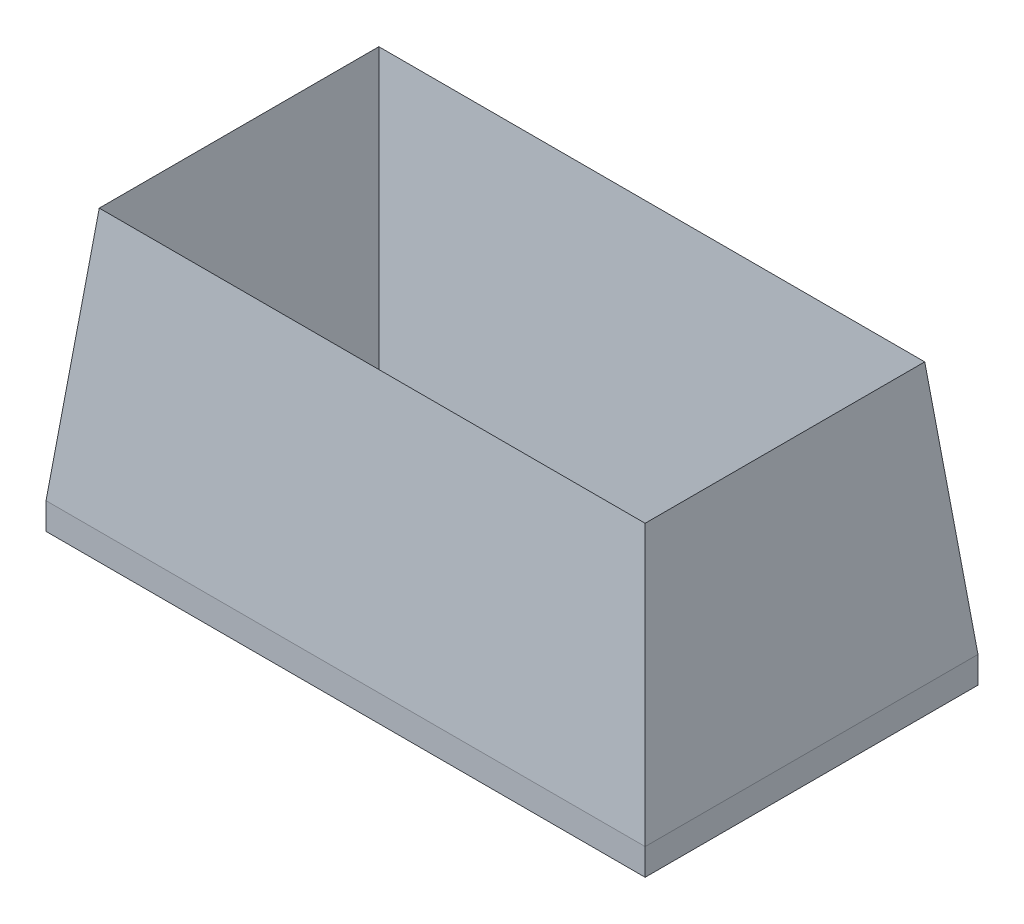
ISO-10303-21;
HEADER;
FILE_DESCRIPTION(('STEP AP214'),'2;1');
FILE_NAME('part.step','',(''),(''),'','','');
FILE_SCHEMA(('AUTOMOTIVE_DESIGN { 1 0 10303 214 1 1 1 1 }'));
ENDSEC;
DATA;
#1=APPLICATION_CONTEXT('core data for automotive mechanical design processes');
#2=APPLICATION_PROTOCOL_DEFINITION('international standard','automotive_design',2000,#1);
#3=PRODUCT_CONTEXT('',#1,'mechanical');
#4=PRODUCT('Part','Part','',(#3));
#5=PRODUCT_RELATED_PRODUCT_CATEGORY('part','',(#4));
#6=PRODUCT_DEFINITION_FORMATION('','',#4);
#7=PRODUCT_DEFINITION_CONTEXT('part definition',#1,'design');
#8=PRODUCT_DEFINITION('design','',#6,#7);
#9=PRODUCT_DEFINITION_SHAPE('','',#8);
#10=(LENGTH_UNIT() NAMED_UNIT(*) SI_UNIT(.MILLI.,.METRE.));
#11=(NAMED_UNIT(*) PLANE_ANGLE_UNIT() SI_UNIT($,.RADIAN.));
#12=(NAMED_UNIT(*) SI_UNIT($,.STERADIAN.) SOLID_ANGLE_UNIT());
#13=UNCERTAINTY_MEASURE_WITH_UNIT(LENGTH_MEASURE(1.E-05),#10,'distance_accuracy_value','');
#14=(GEOMETRIC_REPRESENTATION_CONTEXT(3) GLOBAL_UNCERTAINTY_ASSIGNED_CONTEXT((#13)) GLOBAL_UNIT_ASSIGNED_CONTEXT((#10,
#11,#12)) REPRESENTATION_CONTEXT('',''));
#15=CARTESIAN_POINT('',(0.,0.,0.));
#16=DIRECTION('',(0.,0.,1.));
#17=DIRECTION('',(1.,0.,0.));
#18=AXIS2_PLACEMENT_3D('',#15,#16,#17);
#19=CARTESIAN_POINT('',(22.5,2.,-12.5));
#20=DIRECTION('',(-1.,0.,0.));
#21=DIRECTION('',(0.,0.,1.));
#22=AXIS2_PLACEMENT_3D('',#19,#20,#21);
#23=PLANE('',#22);
#24=DIRECTION('',(0.,0.,-1.));
#25=VECTOR('',#24,1.);
#26=CARTESIAN_POINT('',(22.5,0.,-12.5));
#27=LINE('',#26,#25);
#28=CARTESIAN_POINT('',(22.5,0.,12.5));
#29=VERTEX_POINT('',#28);
#30=CARTESIAN_POINT('',(22.5,0.,-12.5));
#31=VERTEX_POINT('',#30);
#32=EDGE_CURVE('E171',#29,#31,#27,.T.);
#33=ORIENTED_EDGE('',*,*,#32,.T.);
#34=DIRECTION('',(0.,-1.,0.));
#35=VECTOR('',#34,1.);
#36=CARTESIAN_POINT('',(22.5,2.,-12.5));
#37=LINE('',#36,#35);
#38=CARTESIAN_POINT('',(22.5,2.,-12.5));
#39=VERTEX_POINT('',#38);
#40=EDGE_CURVE('E11',#39,#31,#37,.T.);
#41=ORIENTED_EDGE('',*,*,#40,.F.);
#42=DIRECTION('',(0.,0.,-1.));
#43=VECTOR('',#42,1.);
#44=CARTESIAN_POINT('',(22.5,2.,-12.5));
#45=LINE('',#44,#43);
#46=CARTESIAN_POINT('',(22.5,2.,12.5));
#47=VERTEX_POINT('',#46);
#48=EDGE_CURVE('E172',#47,#39,#45,.T.);
#49=ORIENTED_EDGE('',*,*,#48,.F.);
#50=DIRECTION('',(0.,-1.,0.));
#51=VECTOR('',#50,1.);
#52=CARTESIAN_POINT('',(22.5,2.,12.5));
#53=LINE('',#52,#51);
#54=EDGE_CURVE('E189',#47,#29,#53,.T.);
#55=ORIENTED_EDGE('',*,*,#54,.T.);
#56=EDGE_LOOP('',(#33,#41,#49,#55));
#57=FACE_BOUND('',#56,.T.);
#58=ADVANCED_FACE('F45',(#57),#23,.F.);
#59=CARTESIAN_POINT('',(-22.5,2.,-12.5));
#60=DIRECTION('',(0.,0.,1.));
#61=DIRECTION('',(1.,0.,0.));
#62=AXIS2_PLACEMENT_3D('',#59,#60,#61);
#63=PLANE('',#62);
#64=DIRECTION('',(-1.,0.,0.));
#65=VECTOR('',#64,1.);
#66=CARTESIAN_POINT('',(-22.5,0.,-12.5));
#67=LINE('',#66,#65);
#68=CARTESIAN_POINT('',(-22.5,0.,-12.5));
#69=VERTEX_POINT('',#68);
#70=EDGE_CURVE('E193',#31,#69,#67,.T.);
#71=ORIENTED_EDGE('',*,*,#70,.T.);
#72=DIRECTION('',(0.,-1.,0.));
#73=VECTOR('',#72,1.);
#74=CARTESIAN_POINT('',(-22.5,2.,-12.5));
#75=LINE('',#74,#73);
#76=CARTESIAN_POINT('',(-22.5,2.,-12.5));
#77=VERTEX_POINT('',#76);
#78=EDGE_CURVE('E53',#77,#69,#75,.T.);
#79=ORIENTED_EDGE('',*,*,#78,.F.);
#80=DIRECTION('',(-1.,0.,0.));
#81=VECTOR('',#80,1.);
#82=CARTESIAN_POINT('',(-22.5,2.,-12.5));
#83=LINE('',#82,#81);
#84=EDGE_CURVE('E176',#39,#77,#83,.T.);
#85=ORIENTED_EDGE('',*,*,#84,.F.);
#86=ORIENTED_EDGE('',*,*,#40,.T.);
#87=EDGE_LOOP('',(#71,#79,#85,#86));
#88=FACE_BOUND('',#87,.T.);
#89=ADVANCED_FACE('F235',(#88),#63,.F.);
#90=CARTESIAN_POINT('',(-22.5,2.,-12.5));
#91=DIRECTION('',(1.,0.,0.));
#92=DIRECTION('',(0.,0.,-1.));
#93=AXIS2_PLACEMENT_3D('',#90,#91,#92);
#94=PLANE('',#93);
#95=DIRECTION('',(0.,0.,1.));
#96=VECTOR('',#95,1.);
#97=CARTESIAN_POINT('',(-22.5,0.,-12.5));
#98=LINE('',#97,#96);
#99=CARTESIAN_POINT('',(-22.5,0.,12.5));
#100=VERTEX_POINT('',#99);
#101=EDGE_CURVE('E196',#69,#100,#98,.T.);
#102=ORIENTED_EDGE('',*,*,#101,.T.);
#103=DIRECTION('',(0.,-1.,0.));
#104=VECTOR('',#103,1.);
#105=CARTESIAN_POINT('',(-22.5,2.,12.5));
#106=LINE('',#105,#104);
#107=CARTESIAN_POINT('',(-22.5,2.,12.5));
#108=VERTEX_POINT('',#107);
#109=EDGE_CURVE('E204',#108,#100,#106,.T.);
#110=ORIENTED_EDGE('',*,*,#109,.F.);
#111=DIRECTION('',(0.,0.,1.));
#112=VECTOR('',#111,1.);
#113=CARTESIAN_POINT('',(-22.5,2.,-12.5));
#114=LINE('',#113,#112);
#115=EDGE_CURVE('E181',#77,#108,#114,.T.);
#116=ORIENTED_EDGE('',*,*,#115,.F.);
#117=ORIENTED_EDGE('',*,*,#78,.T.);
#118=EDGE_LOOP('',(#102,#110,#116,#117));
#119=FACE_BOUND('',#118,.T.);
#120=ADVANCED_FACE('F212',(#119),#94,.F.);
#121=CARTESIAN_POINT('',(-22.5,2.,12.5));
#122=DIRECTION('',(0.,0.,-1.));
#123=DIRECTION('',(-1.,0.,0.));
#124=AXIS2_PLACEMENT_3D('',#121,#122,#123);
#125=PLANE('',#124);
#126=DIRECTION('',(1.,0.,0.));
#127=VECTOR('',#126,1.);
#128=CARTESIAN_POINT('',(-22.5,0.,12.5));
#129=LINE('',#128,#127);
#130=EDGE_CURVE('E177',#100,#29,#129,.T.);
#131=ORIENTED_EDGE('',*,*,#130,.T.);
#132=ORIENTED_EDGE('',*,*,#54,.F.);
#133=DIRECTION('',(1.,0.,0.));
#134=VECTOR('',#133,1.);
#135=CARTESIAN_POINT('',(-22.5,2.,12.5));
#136=LINE('',#135,#134);
#137=EDGE_CURVE('E185',#108,#47,#136,.T.);
#138=ORIENTED_EDGE('',*,*,#137,.F.);
#139=ORIENTED_EDGE('',*,*,#109,.T.);
#140=EDGE_LOOP('',(#131,#132,#138,#139));
#141=FACE_BOUND('',#140,.T.);
#142=ADVANCED_FACE('F220',(#141),#125,.F.);
#143=CARTESIAN_POINT('',(0.,0.,0.));
#144=DIRECTION('',(0.,1.,0.));
#145=DIRECTION('',(0.,0.,1.));
#146=AXIS2_PLACEMENT_3D('',#143,#144,#145);
#147=PLANE('',#146);
#148=ORIENTED_EDGE('',*,*,#32,.F.);
#149=ORIENTED_EDGE('',*,*,#130,.F.);
#150=ORIENTED_EDGE('',*,*,#101,.F.);
#151=ORIENTED_EDGE('',*,*,#70,.F.);
#152=EDGE_LOOP('',(#148,#149,#150,#151));
#153=FACE_BOUND('',#152,.T.);
#154=ADVANCED_FACE('F218',(#153),#147,.F.);
#155=CARTESIAN_POINT('',(-22.5,2.,12.5));
#156=DIRECTION('',(0.,0.104528463267653,0.994521895368273));
#157=DIRECTION('',(0.,-0.994521895368274,0.104528463267654));
#158=AXIS2_PLACEMENT_3D('',#155,#156,#157);
#159=PLANE('',#158);
#160=DIRECTION('',(-1.,0.,0.));
#161=VECTOR('',#160,1.);
#162=CARTESIAN_POINT('',(-22.5,21.0287289084452,10.5));
#163=LINE('',#162,#161);
#164=CARTESIAN_POINT('',(-20.5,21.0287289084452,10.5));
#165=VERTEX_POINT('',#164);
#166=CARTESIAN_POINT('',(20.5,21.0287289084452,10.5));
#167=VERTEX_POINT('',#166);
#168=EDGE_CURVE('E141',#165,#167,#163,.F.);
#169=ORIENTED_EDGE('',*,*,#168,.F.);
#170=DIRECTION('',(-0.103962051184498,-0.989132844377854,0.103962051184498));
#171=VECTOR('',#170,1.);
#172=CARTESIAN_POINT('',(-22.5,2.,12.5));
#173=LINE('',#172,#171);
#174=EDGE_CURVE('E143',#165,#108,#173,.T.);
#175=ORIENTED_EDGE('',*,*,#174,.T.);
#176=ORIENTED_EDGE('',*,*,#137,.T.);
#177=DIRECTION('',(0.103962051184498,-0.989132844377854,0.103962051184498));
#178=VECTOR('',#177,1.);
#179=CARTESIAN_POINT('',(22.5,2.,12.5));
#180=LINE('',#179,#178);
#181=EDGE_CURVE('E137',#167,#47,#180,.T.);
#182=ORIENTED_EDGE('',*,*,#181,.F.);
#183=EDGE_LOOP('',(#169,#175,#176,#182));
#184=FACE_BOUND('',#183,.T.);
#185=ADVANCED_FACE('F229',(#184),#159,.T.);
#186=CARTESIAN_POINT('',(22.5,2.,12.5));
#187=DIRECTION('',(0.994521895368273,0.104528463267653,0.));
#188=DIRECTION('',(-0.104528463267653,0.994521895368273,0.));
#189=AXIS2_PLACEMENT_3D('',#186,#187,#188);
#190=PLANE('',#189);
#191=DIRECTION('',(0.,0.,1.));
#192=VECTOR('',#191,1.);
#193=CARTESIAN_POINT('',(20.5,21.0287289084452,12.5));
#194=LINE('',#193,#192);
#195=CARTESIAN_POINT('',(20.5,21.0287289084452,-10.5));
#196=VERTEX_POINT('',#195);
#197=EDGE_CURVE('E161',#167,#196,#194,.F.);
#198=ORIENTED_EDGE('',*,*,#197,.F.);
#199=ORIENTED_EDGE('',*,*,#181,.T.);
#200=ORIENTED_EDGE('',*,*,#48,.T.);
#201=DIRECTION('',(0.103962051184498,-0.989132844377854,-0.103962051184498));
#202=VECTOR('',#201,1.);
#203=CARTESIAN_POINT('',(22.5,2.,-12.5));
#204=LINE('',#203,#202);
#205=EDGE_CURVE('E142',#196,#39,#204,.T.);
#206=ORIENTED_EDGE('',*,*,#205,.F.);
#207=EDGE_LOOP('',(#198,#199,#200,#206));
#208=FACE_BOUND('',#207,.T.);
#209=ADVANCED_FACE('F227',(#208),#190,.T.);
#210=CARTESIAN_POINT('',(22.5,2.,-12.5));
#211=DIRECTION('',(0.,0.104528463267653,-0.994521895368273));
#212=DIRECTION('',(0.,0.994521895368274,0.104528463267654));
#213=AXIS2_PLACEMENT_3D('',#210,#211,#212);
#214=PLANE('',#213);
#215=DIRECTION('',(1.,0.,0.));
#216=VECTOR('',#215,1.);
#217=CARTESIAN_POINT('',(22.5,21.0287289084452,-10.5));
#218=LINE('',#217,#216);
#219=CARTESIAN_POINT('',(-20.5,21.0287289084452,-10.5));
#220=VERTEX_POINT('',#219);
#221=EDGE_CURVE('E165',#196,#220,#218,.F.);
#222=ORIENTED_EDGE('',*,*,#221,.F.);
#223=ORIENTED_EDGE('',*,*,#205,.T.);
#224=ORIENTED_EDGE('',*,*,#84,.T.);
#225=DIRECTION('',(-0.103962051184498,-0.989132844377854,-0.103962051184498));
#226=VECTOR('',#225,1.);
#227=CARTESIAN_POINT('',(-22.5,2.,-12.5));
#228=LINE('',#227,#226);
#229=EDGE_CURVE('E147',#220,#77,#228,.T.);
#230=ORIENTED_EDGE('',*,*,#229,.F.);
#231=EDGE_LOOP('',(#222,#223,#224,#230));
#232=FACE_BOUND('',#231,.T.);
#233=ADVANCED_FACE('F234',(#232),#214,.T.);
#234=CARTESIAN_POINT('',(-22.5,2.,-12.5));
#235=DIRECTION('',(-0.994521895368273,0.104528463267653,0.));
#236=DIRECTION('',(-0.104528463267653,-0.994521895368273,0.));
#237=AXIS2_PLACEMENT_3D('',#234,#235,#236);
#238=PLANE('',#237);
#239=DIRECTION('',(0.,0.,-1.));
#240=VECTOR('',#239,1.);
#241=CARTESIAN_POINT('',(-20.5,21.0287289084452,-12.5));
#242=LINE('',#241,#240);
#243=EDGE_CURVE('E120',#220,#165,#242,.F.);
#244=ORIENTED_EDGE('',*,*,#243,.F.);
#245=ORIENTED_EDGE('',*,*,#229,.T.);
#246=ORIENTED_EDGE('',*,*,#115,.T.);
#247=ORIENTED_EDGE('',*,*,#174,.F.);
#248=EDGE_LOOP('',(#244,#245,#246,#247));
#249=FACE_BOUND('',#248,.T.);
#250=ADVANCED_FACE('F231',(#249),#238,.T.);
#251=CARTESIAN_POINT('',(18.5,2.,-8.5));
#252=DIRECTION('',(-0.994521895368273,0.104528463267653,0.));
#253=DIRECTION('',(-0.104528463267653,-0.994521895368273,0.));
#254=AXIS2_PLACEMENT_3D('',#251,#252,#253);
#255=PLANE('',#254);
#256=DIRECTION('',(-0.103962051184498,-0.989132844377854,-0.103962051184498));
#257=VECTOR('',#256,1.);
#258=CARTESIAN_POINT('',(18.3162621625297,0.25185125027687,8.3162621625297));
#259=LINE('',#258,#257);
#260=CARTESIAN_POINT('',(18.5,2.,8.5));
#261=VERTEX_POINT('',#260);
#262=EDGE_CURVE('E127',#167,#261,#259,.T.);
#263=ORIENTED_EDGE('',*,*,#262,.F.);
#264=ORIENTED_EDGE('',*,*,#197,.T.);
#265=DIRECTION('',(-0.103962051184498,-0.989132844377854,0.103962051184498));
#266=VECTOR('',#265,1.);
#267=CARTESIAN_POINT('',(18.1001000007999,-1.8047943376327,-8.10010000079994));
#268=LINE('',#267,#266);
#269=CARTESIAN_POINT('',(18.5,2.,-8.5));
#270=VERTEX_POINT('',#269);
#271=EDGE_CURVE('E148',#196,#270,#268,.T.);
#272=ORIENTED_EDGE('',*,*,#271,.T.);
#273=DIRECTION('',(0.,0.,-1.));
#274=VECTOR('',#273,1.);
#275=CARTESIAN_POINT('',(18.5,2.,-8.5));
#276=LINE('',#275,#274);
#277=EDGE_CURVE('E60',#261,#270,#276,.T.);
#278=ORIENTED_EDGE('',*,*,#277,.F.);
#279=EDGE_LOOP('',(#263,#264,#272,#278));
#280=FACE_BOUND('',#279,.T.);
#281=ADVANCED_FACE('F256',(#280),#255,.T.);
#282=CARTESIAN_POINT('',(-18.5,2.,-8.5));
#283=DIRECTION('',(0.,0.104528463267653,0.994521895368273));
#284=DIRECTION('',(0.,-0.994521895368273,0.104528463267653));
#285=AXIS2_PLACEMENT_3D('',#282,#283,#284);
#286=PLANE('',#285);
#287=ORIENTED_EDGE('',*,*,#271,.F.);
#288=ORIENTED_EDGE('',*,*,#221,.T.);
#289=DIRECTION('',(0.103962051184498,-0.989132844377854,0.103962051184498));
#290=VECTOR('',#289,1.);
#291=CARTESIAN_POINT('',(-18.5,2.,-8.5));
#292=LINE('',#291,#290);
#293=CARTESIAN_POINT('',(-18.5,2.,-8.5));
#294=VERTEX_POINT('',#293);
#295=EDGE_CURVE('E126',#220,#294,#292,.T.);
#296=ORIENTED_EDGE('',*,*,#295,.T.);
#297=DIRECTION('',(-1.,0.,0.));
#298=VECTOR('',#297,1.);
#299=CARTESIAN_POINT('',(-18.5,2.,-8.5));
#300=LINE('',#299,#298);
#301=EDGE_CURVE('E65',#270,#294,#300,.T.);
#302=ORIENTED_EDGE('',*,*,#301,.F.);
#303=EDGE_LOOP('',(#287,#288,#296,#302));
#304=FACE_BOUND('',#303,.T.);
#305=ADVANCED_FACE('F253',(#304),#286,.T.);
#306=CARTESIAN_POINT('',(-18.5,2.,-8.5));
#307=DIRECTION('',(0.994521895368273,0.104528463267653,0.));
#308=DIRECTION('',(-0.104528463267653,0.994521895368273,0.));
#309=AXIS2_PLACEMENT_3D('',#306,#307,#308);
#310=PLANE('',#309);
#311=ORIENTED_EDGE('',*,*,#295,.F.);
#312=ORIENTED_EDGE('',*,*,#243,.T.);
#313=DIRECTION('',(0.103962051184498,-0.989132844377854,-0.103962051184498));
#314=VECTOR('',#313,1.);
#315=CARTESIAN_POINT('',(-18.5,2.,8.5));
#316=LINE('',#315,#314);
#317=CARTESIAN_POINT('',(-18.5,2.,8.5));
#318=VERTEX_POINT('',#317);
#319=EDGE_CURVE('E118',#165,#318,#316,.T.);
#320=ORIENTED_EDGE('',*,*,#319,.T.);
#321=DIRECTION('',(0.,0.,1.));
#322=VECTOR('',#321,1.);
#323=CARTESIAN_POINT('',(-18.5,2.,-8.5));
#324=LINE('',#323,#322);
#325=EDGE_CURVE('E107',#294,#318,#324,.T.);
#326=ORIENTED_EDGE('',*,*,#325,.F.);
#327=EDGE_LOOP('',(#311,#312,#320,#326));
#328=FACE_BOUND('',#327,.T.);
#329=ADVANCED_FACE('F119',(#328),#310,.T.);
#330=CARTESIAN_POINT('',(-18.5,2.,8.5));
#331=DIRECTION('',(0.,0.104528463267653,-0.994521895368273));
#332=DIRECTION('',(0.,0.994521895368273,0.104528463267653));
#333=AXIS2_PLACEMENT_3D('',#330,#331,#332);
#334=PLANE('',#333);
#335=ORIENTED_EDGE('',*,*,#319,.F.);
#336=ORIENTED_EDGE('',*,*,#168,.T.);
#337=ORIENTED_EDGE('',*,*,#262,.T.);
#338=DIRECTION('',(1.,0.,0.));
#339=VECTOR('',#338,1.);
#340=CARTESIAN_POINT('',(-18.5,2.,8.5));
#341=LINE('',#340,#339);
#342=EDGE_CURVE('E111',#318,#261,#341,.T.);
#343=ORIENTED_EDGE('',*,*,#342,.F.);
#344=EDGE_LOOP('',(#335,#336,#337,#343));
#345=FACE_BOUND('',#344,.T.);
#346=ADVANCED_FACE('F129',(#345),#334,.T.);
#347=CARTESIAN_POINT('',(0.,2.,0.));
#348=DIRECTION('',(0.,1.,0.));
#349=DIRECTION('',(0.,0.,1.));
#350=AXIS2_PLACEMENT_3D('',#347,#348,#349);
#351=PLANE('',#350);
#352=ORIENTED_EDGE('',*,*,#277,.T.);
#353=ORIENTED_EDGE('',*,*,#301,.T.);
#354=ORIENTED_EDGE('',*,*,#325,.T.);
#355=ORIENTED_EDGE('',*,*,#342,.T.);
#356=EDGE_LOOP('',(#352,#353,#354,#355));
#357=FACE_BOUND('',#356,.T.);
#358=ADVANCED_FACE('F109',(#357),#351,.T.);
#359=CLOSED_SHELL('',(#58,#89,#120,#142,#154,#185,#209,#233,#250,#281,#305,#329,#346,#358));
#360=MANIFOLD_SOLID_BREP('B2',#359);
#361=ADVANCED_BREP_SHAPE_REPRESENTATION('',(#18,#360),#14);
#362=SHAPE_DEFINITION_REPRESENTATION(#9,#361);
ENDSEC;
END-ISO-10303-21;
